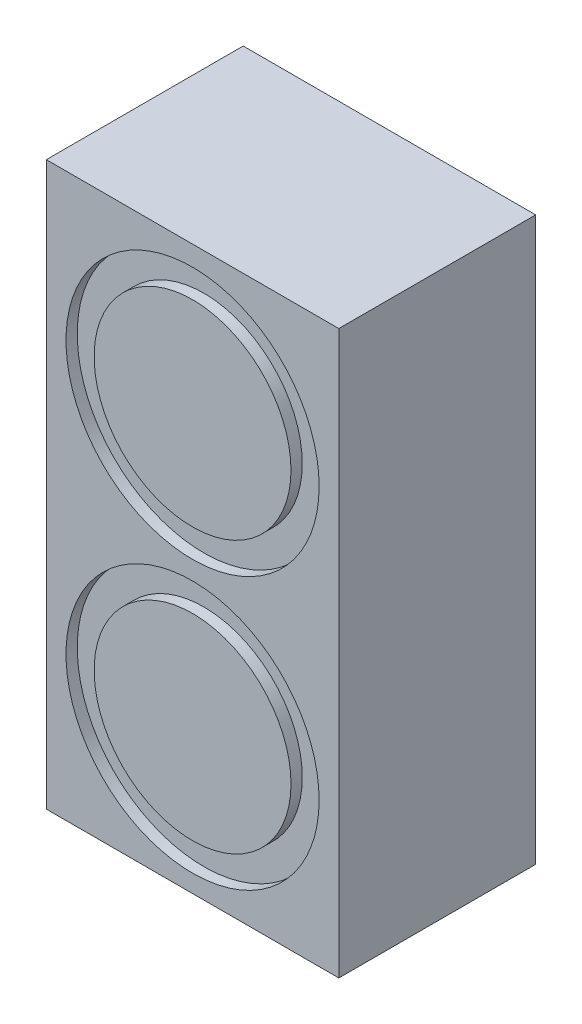
ISO-10303-21;
HEADER;
FILE_DESCRIPTION(('STEP AP214'),'2;1');
FILE_NAME('part.step','',(''),(''),'','','');
FILE_SCHEMA(('AUTOMOTIVE_DESIGN { 1 0 10303 214 1 1 1 1 }'));
ENDSEC;
DATA;
#1=APPLICATION_CONTEXT('core data for automotive mechanical design processes');
#2=APPLICATION_PROTOCOL_DEFINITION('international standard','automotive_design',2000,#1);
#3=PRODUCT_CONTEXT('',#1,'mechanical');
#4=PRODUCT('Part','Part','',(#3));
#5=PRODUCT_RELATED_PRODUCT_CATEGORY('part','',(#4));
#6=PRODUCT_DEFINITION_FORMATION('','',#4);
#7=PRODUCT_DEFINITION_CONTEXT('part definition',#1,'design');
#8=PRODUCT_DEFINITION('design','',#6,#7);
#9=PRODUCT_DEFINITION_SHAPE('','',#8);
#10=(LENGTH_UNIT() NAMED_UNIT(*) SI_UNIT(.MILLI.,.METRE.));
#11=(NAMED_UNIT(*) PLANE_ANGLE_UNIT() SI_UNIT($,.RADIAN.));
#12=(NAMED_UNIT(*) SI_UNIT($,.STERADIAN.) SOLID_ANGLE_UNIT());
#13=UNCERTAINTY_MEASURE_WITH_UNIT(LENGTH_MEASURE(1.E-05),#10,'distance_accuracy_value','');
#14=(GEOMETRIC_REPRESENTATION_CONTEXT(3) GLOBAL_UNCERTAINTY_ASSIGNED_CONTEXT((#13)) GLOBAL_UNIT_ASSIGNED_CONTEXT((#10,
#11,#12)) REPRESENTATION_CONTEXT('',''));
#15=CARTESIAN_POINT('',(0.,0.,0.));
#16=DIRECTION('',(0.,0.,1.));
#17=DIRECTION('',(1.,0.,0.));
#18=AXIS2_PLACEMENT_3D('',#15,#16,#17);
#19=CARTESIAN_POINT('',(-30.9415824826783,28.2778864970646,35.));
#20=DIRECTION('',(1.,0.,0.));
#21=DIRECTION('',(0.,0.,-1.));
#22=AXIS2_PLACEMENT_3D('',#19,#20,#21);
#23=PLANE('',#22);
#24=DIRECTION('',(0.,-1.,0.));
#25=VECTOR('',#24,1.);
#26=CARTESIAN_POINT('',(-30.9415824826783,28.2778864970646,0.));
#27=LINE('',#26,#25);
#28=CARTESIAN_POINT('',(-30.9415824826783,28.2778864970646,0.));
#29=VERTEX_POINT('',#28);
#30=CARTESIAN_POINT('',(-30.9415824826783,-71.7221135029354,0.));
#31=VERTEX_POINT('',#30);
#32=EDGE_CURVE('E96',#29,#31,#27,.T.);
#33=ORIENTED_EDGE('',*,*,#32,.T.);
#34=DIRECTION('',(0.,0.,-1.));
#35=VECTOR('',#34,1.);
#36=CARTESIAN_POINT('',(-30.9415824826783,-71.7221135029354,35.));
#37=LINE('',#36,#35);
#38=CARTESIAN_POINT('',(-30.9415824826783,-71.7221135029354,35.));
#39=VERTEX_POINT('',#38);
#40=EDGE_CURVE('E11',#39,#31,#37,.T.);
#41=ORIENTED_EDGE('',*,*,#40,.F.);
#42=DIRECTION('',(0.,-1.,0.));
#43=VECTOR('',#42,1.);
#44=CARTESIAN_POINT('',(-30.9415824826783,28.2778864970646,35.));
#45=LINE('',#44,#43);
#46=CARTESIAN_POINT('',(-30.9415824826783,28.2778864970646,35.));
#47=VERTEX_POINT('',#46);
#48=EDGE_CURVE('E84',#47,#39,#45,.T.);
#49=ORIENTED_EDGE('',*,*,#48,.F.);
#50=DIRECTION('',(0.,0.,-1.));
#51=VECTOR('',#50,1.);
#52=CARTESIAN_POINT('',(-30.9415824826783,28.2778864970646,35.));
#53=LINE('',#52,#51);
#54=EDGE_CURVE('E92',#47,#29,#53,.T.);
#55=ORIENTED_EDGE('',*,*,#54,.T.);
#56=EDGE_LOOP('',(#33,#41,#49,#55));
#57=FACE_BOUND('',#56,.T.);
#58=ADVANCED_FACE('F33',(#57),#23,.F.);
#59=CARTESIAN_POINT('',(-30.9415824826783,-71.7221135029354,35.));
#60=DIRECTION('',(0.,1.,0.));
#61=DIRECTION('',(-1.,0.,0.));
#62=AXIS2_PLACEMENT_3D('',#59,#60,#61);
#63=PLANE('',#62);
#64=DIRECTION('',(1.,0.,0.));
#65=VECTOR('',#64,1.);
#66=CARTESIAN_POINT('',(-30.9415824826783,-71.7221135029354,0.));
#67=LINE('',#66,#65);
#68=CARTESIAN_POINT('',(21.0584175173217,-71.7221135029354,0.));
#69=VERTEX_POINT('',#68);
#70=EDGE_CURVE('E88',#31,#69,#67,.T.);
#71=ORIENTED_EDGE('',*,*,#70,.T.);
#72=DIRECTION('',(0.,0.,-1.));
#73=VECTOR('',#72,1.);
#74=CARTESIAN_POINT('',(21.0584175173217,-71.7221135029354,35.));
#75=LINE('',#74,#73);
#76=CARTESIAN_POINT('',(21.0584175173217,-71.7221135029354,35.));
#77=VERTEX_POINT('',#76);
#78=EDGE_CURVE('E41',#77,#69,#75,.T.);
#79=ORIENTED_EDGE('',*,*,#78,.F.);
#80=DIRECTION('',(1.,0.,0.));
#81=VECTOR('',#80,1.);
#82=CARTESIAN_POINT('',(-30.9415824826783,-71.7221135029354,35.));
#83=LINE('',#82,#81);
#84=EDGE_CURVE('E79',#39,#77,#83,.T.);
#85=ORIENTED_EDGE('',*,*,#84,.F.);
#86=ORIENTED_EDGE('',*,*,#40,.T.);
#87=EDGE_LOOP('',(#71,#79,#85,#86));
#88=FACE_BOUND('',#87,.T.);
#89=ADVANCED_FACE('F87',(#88),#63,.F.);
#90=CARTESIAN_POINT('',(21.0584175173217,28.2778864970646,35.));
#91=DIRECTION('',(-1.,0.,0.));
#92=DIRECTION('',(0.,-1.,0.));
#93=AXIS2_PLACEMENT_3D('',#90,#91,#92);
#94=PLANE('',#93);
#95=DIRECTION('',(0.,1.,0.));
#96=VECTOR('',#95,1.);
#97=CARTESIAN_POINT('',(21.0584175173217,28.2778864970646,0.));
#98=LINE('',#97,#96);
#99=CARTESIAN_POINT('',(21.0584175173217,28.2778864970646,0.));
#100=VERTEX_POINT('',#99);
#101=EDGE_CURVE('E66',#69,#100,#98,.T.);
#102=ORIENTED_EDGE('',*,*,#101,.T.);
#103=DIRECTION('',(0.,0.,-1.));
#104=VECTOR('',#103,1.);
#105=CARTESIAN_POINT('',(21.0584175173217,28.2778864970646,35.));
#106=LINE('',#105,#104);
#107=CARTESIAN_POINT('',(21.0584175173217,28.2778864970646,35.));
#108=VERTEX_POINT('',#107);
#109=EDGE_CURVE('E89',#108,#100,#106,.T.);
#110=ORIENTED_EDGE('',*,*,#109,.F.);
#111=DIRECTION('',(0.,1.,0.));
#112=VECTOR('',#111,1.);
#113=CARTESIAN_POINT('',(21.0584175173217,28.2778864970646,35.));
#114=LINE('',#113,#112);
#115=EDGE_CURVE('E82',#77,#108,#114,.T.);
#116=ORIENTED_EDGE('',*,*,#115,.F.);
#117=ORIENTED_EDGE('',*,*,#78,.T.);
#118=EDGE_LOOP('',(#102,#110,#116,#117));
#119=FACE_BOUND('',#118,.T.);
#120=ADVANCED_FACE('F90',(#119),#94,.F.);
#121=CARTESIAN_POINT('',(-30.9415824826783,28.2778864970646,35.));
#122=DIRECTION('',(0.,-1.,0.));
#123=DIRECTION('',(0.,0.,-1.));
#124=AXIS2_PLACEMENT_3D('',#121,#122,#123);
#125=PLANE('',#124);
#126=DIRECTION('',(-1.,0.,0.));
#127=VECTOR('',#126,1.);
#128=CARTESIAN_POINT('',(-30.9415824826783,28.2778864970646,0.));
#129=LINE('',#128,#127);
#130=EDGE_CURVE('E72',#100,#29,#129,.T.);
#131=ORIENTED_EDGE('',*,*,#130,.T.);
#132=ORIENTED_EDGE('',*,*,#54,.F.);
#133=DIRECTION('',(-1.,0.,0.));
#134=VECTOR('',#133,1.);
#135=CARTESIAN_POINT('',(-30.9415824826783,28.2778864970646,35.));
#136=LINE('',#135,#134);
#137=EDGE_CURVE('E49',#108,#47,#136,.T.);
#138=ORIENTED_EDGE('',*,*,#137,.F.);
#139=ORIENTED_EDGE('',*,*,#109,.T.);
#140=EDGE_LOOP('',(#131,#132,#138,#139));
#141=FACE_BOUND('',#140,.T.);
#142=ADVANCED_FACE('F104',(#141),#125,.F.);
#143=CARTESIAN_POINT('',(0.,0.,35.));
#144=DIRECTION('',(0.,0.,1.));
#145=DIRECTION('',(1.,0.,0.));
#146=AXIS2_PLACEMENT_3D('',#143,#144,#145);
#147=PLANE('',#146);
#148=CARTESIAN_POINT('',(-4.94158248267834,2.22479052734367,35.));
#149=DIRECTION('',(0.,0.,1.));
#150=DIRECTION('',(1.,0.,0.));
#151=AXIS2_PLACEMENT_3D('',#148,#149,#150);
#152=CIRCLE('',#151,22.5);
#153=CARTESIAN_POINT('',(17.5584175173217,2.22479052734367,35.));
#154=VERTEX_POINT('',#153);
#155=EDGE_CURVE('E123',#154,#154,#152,.T.);
#156=ORIENTED_EDGE('',*,*,#155,.F.);
#157=EDGE_LOOP('',(#156));
#158=FACE_BOUND('',#157,.T.);
#159=CARTESIAN_POINT('',(-4.94158248267834,-46.0830850380606,35.));
#160=DIRECTION('',(0.,0.,1.));
#161=DIRECTION('',(1.,0.,0.));
#162=AXIS2_PLACEMENT_3D('',#159,#160,#161);
#163=CIRCLE('',#162,22.5);
#164=CARTESIAN_POINT('',(17.5584175173217,-46.0830850380606,35.));
#165=VERTEX_POINT('',#164);
#166=EDGE_CURVE('E110',#165,#165,#163,.T.);
#167=ORIENTED_EDGE('',*,*,#166,.F.);
#168=EDGE_LOOP('',(#167));
#169=FACE_BOUND('',#168,.T.);
#170=ORIENTED_EDGE('',*,*,#48,.T.);
#171=ORIENTED_EDGE('',*,*,#84,.T.);
#172=ORIENTED_EDGE('',*,*,#115,.T.);
#173=ORIENTED_EDGE('',*,*,#137,.T.);
#174=EDGE_LOOP('',(#170,#171,#172,#173));
#175=FACE_BOUND('',#174,.T.);
#176=ADVANCED_FACE('F80',(#158,#169,#175),#147,.T.);
#177=CARTESIAN_POINT('',(0.,0.,0.));
#178=DIRECTION('',(0.,0.,1.));
#179=DIRECTION('',(1.,0.,0.));
#180=AXIS2_PLACEMENT_3D('',#177,#178,#179);
#181=PLANE('',#180);
#182=ORIENTED_EDGE('',*,*,#32,.F.);
#183=ORIENTED_EDGE('',*,*,#130,.F.);
#184=ORIENTED_EDGE('',*,*,#101,.F.);
#185=ORIENTED_EDGE('',*,*,#70,.F.);
#186=EDGE_LOOP('',(#182,#183,#184,#185));
#187=FACE_BOUND('',#186,.T.);
#188=ADVANCED_FACE('F107',(#187),#181,.F.);
#189=CARTESIAN_POINT('',(-4.94158248267834,-46.0830850380606,33.));
#190=DIRECTION('',(0.,0.,1.));
#191=DIRECTION('',(1.,0.,0.));
#192=AXIS2_PLACEMENT_3D('',#189,#190,#191);
#193=CYLINDRICAL_SURFACE('',#192,22.5);
#194=CARTESIAN_POINT('',(-4.94158248267834,-46.0830850380606,33.));
#195=DIRECTION('',(0.,0.,1.));
#196=DIRECTION('',(1.,0.,0.));
#197=AXIS2_PLACEMENT_3D('',#194,#195,#196);
#198=CIRCLE('',#197,22.5);
#199=CARTESIAN_POINT('',(17.5584175173217,-46.0830850380606,33.));
#200=VERTEX_POINT('',#199);
#201=EDGE_CURVE('E113',#200,#200,#198,.T.);
#202=ORIENTED_EDGE('',*,*,#201,.F.);
#203=EDGE_LOOP('',(#202));
#204=FACE_BOUND('',#203,.T.);
#205=ORIENTED_EDGE('',*,*,#166,.T.);
#206=EDGE_LOOP('',(#205));
#207=FACE_BOUND('',#206,.T.);
#208=ADVANCED_FACE('F157',(#204,#207),#193,.F.);
#209=CARTESIAN_POINT('',(-4.94158248267834,-46.0830850380606,33.));
#210=DIRECTION('',(0.,0.,1.));
#211=DIRECTION('',(1.,0.,0.));
#212=AXIS2_PLACEMENT_3D('',#209,#210,#211);
#213=PLANE('',#212);
#214=CARTESIAN_POINT('',(-4.94158248267834,-46.0830850380606,33.));
#215=DIRECTION('',(0.,0.,1.));
#216=DIRECTION('',(1.,0.,0.));
#217=AXIS2_PLACEMENT_3D('',#214,#215,#216);
#218=CIRCLE('',#217,17.5);
#219=CARTESIAN_POINT('',(12.5584175173217,-46.0830850380606,33.));
#220=VERTEX_POINT('',#219);
#221=EDGE_CURVE('E114',#220,#220,#218,.T.);
#222=ORIENTED_EDGE('',*,*,#221,.F.);
#223=EDGE_LOOP('',(#222));
#224=FACE_BOUND('',#223,.T.);
#225=ORIENTED_EDGE('',*,*,#201,.T.);
#226=EDGE_LOOP('',(#225));
#227=FACE_BOUND('',#226,.T.);
#228=ADVANCED_FACE('F159',(#224,#227),#213,.T.);
#229=CARTESIAN_POINT('',(-4.94158248267834,-46.0830850380606,33.));
#230=DIRECTION('',(0.,0.,1.));
#231=DIRECTION('',(1.,0.,0.));
#232=AXIS2_PLACEMENT_3D('',#229,#230,#231);
#233=CYLINDRICAL_SURFACE('',#232,17.5);
#234=ORIENTED_EDGE('',*,*,#221,.T.);
#235=EDGE_LOOP('',(#234));
#236=FACE_BOUND('',#235,.T.);
#237=CARTESIAN_POINT('',(-4.94158248267834,-46.0830850380606,35.));
#238=DIRECTION('',(0.,0.,1.));
#239=DIRECTION('',(1.,0.,0.));
#240=AXIS2_PLACEMENT_3D('',#237,#238,#239);
#241=CIRCLE('',#240,17.5);
#242=CARTESIAN_POINT('',(12.5584175173217,-46.0830850380606,35.));
#243=VERTEX_POINT('',#242);
#244=EDGE_CURVE('E118',#243,#243,#241,.T.);
#245=ORIENTED_EDGE('',*,*,#244,.F.);
#246=EDGE_LOOP('',(#245));
#247=FACE_BOUND('',#246,.T.);
#248=ADVANCED_FACE('F146',(#236,#247),#233,.T.);
#249=CARTESIAN_POINT('',(-4.94158248267834,2.22479052734367,33.));
#250=DIRECTION('',(0.,0.,1.));
#251=DIRECTION('',(1.,0.,0.));
#252=AXIS2_PLACEMENT_3D('',#249,#250,#251);
#253=CYLINDRICAL_SURFACE('',#252,22.5);
#254=CARTESIAN_POINT('',(-4.94158248267834,2.22479052734367,33.));
#255=DIRECTION('',(0.,0.,1.));
#256=DIRECTION('',(1.,0.,0.));
#257=AXIS2_PLACEMENT_3D('',#254,#255,#256);
#258=CIRCLE('',#257,22.5);
#259=CARTESIAN_POINT('',(17.5584175173217,2.22479052734367,33.));
#260=VERTEX_POINT('',#259);
#261=EDGE_CURVE('E99',#260,#260,#258,.T.);
#262=ORIENTED_EDGE('',*,*,#261,.F.);
#263=EDGE_LOOP('',(#262));
#264=FACE_BOUND('',#263,.T.);
#265=ORIENTED_EDGE('',*,*,#155,.T.);
#266=EDGE_LOOP('',(#265));
#267=FACE_BOUND('',#266,.T.);
#268=ADVANCED_FACE('F140',(#264,#267),#253,.F.);
#269=CARTESIAN_POINT('',(-4.94158248267834,2.22479052734367,33.));
#270=DIRECTION('',(0.,0.,1.));
#271=DIRECTION('',(1.,0.,0.));
#272=AXIS2_PLACEMENT_3D('',#269,#270,#271);
#273=PLANE('',#272);
#274=CARTESIAN_POINT('',(-4.94158248267834,2.22479052734367,33.));
#275=DIRECTION('',(0.,0.,1.));
#276=DIRECTION('',(1.,0.,0.));
#277=AXIS2_PLACEMENT_3D('',#274,#275,#276);
#278=CIRCLE('',#277,17.5);
#279=CARTESIAN_POINT('',(12.5584175173217,2.22479052734367,33.));
#280=VERTEX_POINT('',#279);
#281=EDGE_CURVE('E126',#280,#280,#278,.T.);
#282=ORIENTED_EDGE('',*,*,#281,.F.);
#283=EDGE_LOOP('',(#282));
#284=FACE_BOUND('',#283,.T.);
#285=ORIENTED_EDGE('',*,*,#261,.T.);
#286=EDGE_LOOP('',(#285));
#287=FACE_BOUND('',#286,.T.);
#288=ADVANCED_FACE('F137',(#284,#287),#273,.T.);
#289=CARTESIAN_POINT('',(-4.94158248267834,2.22479052734367,33.));
#290=DIRECTION('',(0.,0.,1.));
#291=DIRECTION('',(1.,0.,0.));
#292=AXIS2_PLACEMENT_3D('',#289,#290,#291);
#293=CYLINDRICAL_SURFACE('',#292,17.5);
#294=ORIENTED_EDGE('',*,*,#281,.T.);
#295=EDGE_LOOP('',(#294));
#296=FACE_BOUND('',#295,.T.);
#297=CARTESIAN_POINT('',(-4.94158248267834,2.22479052734367,35.));
#298=DIRECTION('',(0.,0.,1.));
#299=DIRECTION('',(1.,0.,0.));
#300=AXIS2_PLACEMENT_3D('',#297,#298,#299);
#301=CIRCLE('',#300,17.5);
#302=CARTESIAN_POINT('',(12.5584175173217,2.22479052734367,35.));
#303=VERTEX_POINT('',#302);
#304=EDGE_CURVE('E117',#303,#303,#301,.T.);
#305=ORIENTED_EDGE('',*,*,#304,.F.);
#306=EDGE_LOOP('',(#305));
#307=FACE_BOUND('',#306,.T.);
#308=ADVANCED_FACE('F134',(#296,#307),#293,.T.);
#309=ORIENTED_EDGE('',*,*,#244,.T.);
#310=EDGE_LOOP('',(#309));
#311=FACE_BOUND('',#310,.T.);
#312=ADVANCED_FACE('F154',(#311),#147,.T.);
#313=ORIENTED_EDGE('',*,*,#304,.T.);
#314=EDGE_LOOP('',(#313));
#315=FACE_BOUND('',#314,.T.);
#316=ADVANCED_FACE('F153',(#315),#147,.T.);
#317=CLOSED_SHELL('',(#58,#89,#120,#142,#176,#188,#208,#228,#248,#268,#288,#308,#312,#316));
#318=MANIFOLD_SOLID_BREP('B2',#317);
#319=ADVANCED_BREP_SHAPE_REPRESENTATION('',(#18,#318),#14);
#320=SHAPE_DEFINITION_REPRESENTATION(#9,#319);
ENDSEC;
END-ISO-10303-21;
